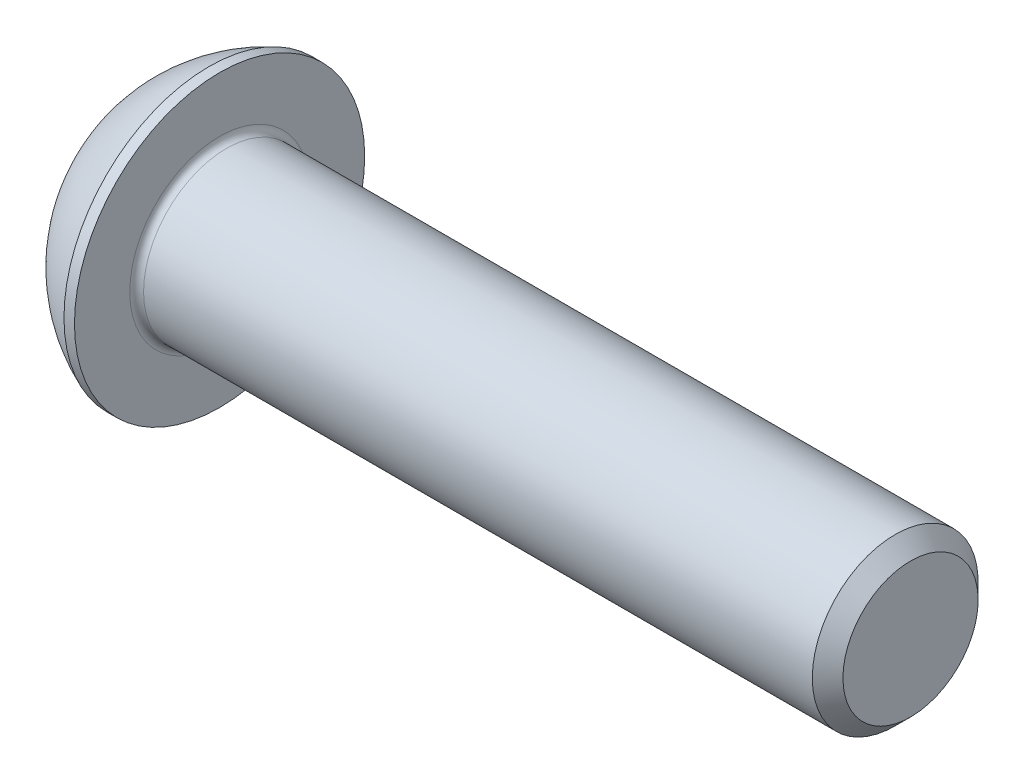
ISO-10303-21;
HEADER;
FILE_DESCRIPTION(('STEP AP214'),'2;1');
FILE_NAME('part.step','',(''),(''),'','','');
FILE_SCHEMA(('AUTOMOTIVE_DESIGN { 1 0 10303 214 1 1 1 1 }'));
ENDSEC;
DATA;
#1=APPLICATION_CONTEXT('core data for automotive mechanical design processes');
#2=APPLICATION_PROTOCOL_DEFINITION('international standard','automotive_design',2000,#1);
#3=PRODUCT_CONTEXT('',#1,'mechanical');
#4=PRODUCT('Part','Part','',(#3));
#5=PRODUCT_RELATED_PRODUCT_CATEGORY('part','',(#4));
#6=PRODUCT_DEFINITION_FORMATION('','',#4);
#7=PRODUCT_DEFINITION_CONTEXT('part definition',#1,'design');
#8=PRODUCT_DEFINITION('design','',#6,#7);
#9=PRODUCT_DEFINITION_SHAPE('','',#8);
#10=(LENGTH_UNIT() NAMED_UNIT(*) SI_UNIT(.MILLI.,.METRE.));
#11=(NAMED_UNIT(*) PLANE_ANGLE_UNIT() SI_UNIT($,.RADIAN.));
#12=(NAMED_UNIT(*) SI_UNIT($,.STERADIAN.) SOLID_ANGLE_UNIT());
#13=UNCERTAINTY_MEASURE_WITH_UNIT(LENGTH_MEASURE(1.E-05),#10,'distance_accuracy_value','');
#14=(GEOMETRIC_REPRESENTATION_CONTEXT(3) GLOBAL_UNCERTAINTY_ASSIGNED_CONTEXT((#13)) GLOBAL_UNIT_ASSIGNED_CONTEXT((#10,
#11,#12)) REPRESENTATION_CONTEXT('',''));
#15=CARTESIAN_POINT('',(0.,0.,0.));
#16=DIRECTION('',(0.,0.,1.));
#17=DIRECTION('',(1.,0.,0.));
#18=AXIS2_PLACEMENT_3D('',#15,#16,#17);
#19=CARTESIAN_POINT('',(0.,0.,0.));
#20=DIRECTION('',(-1.,0.,0.));
#21=DIRECTION('',(0.,0.,1.));
#22=AXIS2_PLACEMENT_3D('',#19,#20,#21);
#23=PLANE('',#22);
#24=CARTESIAN_POINT('',(0.,0.,0.));
#25=DIRECTION('',(-1.,0.,0.));
#26=DIRECTION('',(0.,0.,1.));
#27=AXIS2_PLACEMENT_3D('',#24,#25,#26);
#28=CIRCLE('',#27,2.625);
#29=CARTESIAN_POINT('',(0.,2.625,0.));
#30=VERTEX_POINT('',#29);
#31=EDGE_CURVE('E157',#30,#30,#28,.T.);
#32=ORIENTED_EDGE('',*,*,#31,.T.);
#33=EDGE_LOOP('',(#32));
#34=FACE_BOUND('',#33,.T.);
#35=DIRECTION('',(0.,-1.,0.));
#36=VECTOR('',#35,1.);
#37=CARTESIAN_POINT('',(0.,-1.15470053837925,2.));
#38=LINE('',#37,#36);
#39=CARTESIAN_POINT('',(0.,1.15470053837925,2.));
#40=VERTEX_POINT('',#39);
#41=CARTESIAN_POINT('',(0.,-1.15470053837925,2.));
#42=VERTEX_POINT('',#41);
#43=EDGE_CURVE('E47',#40,#42,#38,.T.);
#44=ORIENTED_EDGE('',*,*,#43,.T.);
#45=DIRECTION('',(0.,-0.5,-0.866025403784439));
#46=VECTOR('',#45,1.);
#47=CARTESIAN_POINT('',(0.,-2.3094010767585,0.));
#48=LINE('',#47,#46);
#49=CARTESIAN_POINT('',(0.,-2.3094010767585,0.));
#50=VERTEX_POINT('',#49);
#51=EDGE_CURVE('E250',#42,#50,#48,.T.);
#52=ORIENTED_EDGE('',*,*,#51,.T.);
#53=DIRECTION('',(0.,0.5,-0.866025403784439));
#54=VECTOR('',#53,1.);
#55=CARTESIAN_POINT('',(0.,-1.15470053837925,-2.));
#56=LINE('',#55,#54);
#57=CARTESIAN_POINT('',(0.,-1.15470053837925,-2.));
#58=VERTEX_POINT('',#57);
#59=EDGE_CURVE('E132',#50,#58,#56,.T.);
#60=ORIENTED_EDGE('',*,*,#59,.T.);
#61=DIRECTION('',(0.,1.,0.));
#62=VECTOR('',#61,1.);
#63=CARTESIAN_POINT('',(0.,1.15470053837925,-2.));
#64=LINE('',#63,#62);
#65=CARTESIAN_POINT('',(0.,1.15470053837925,-2.));
#66=VERTEX_POINT('',#65);
#67=EDGE_CURVE('E253',#58,#66,#64,.T.);
#68=ORIENTED_EDGE('',*,*,#67,.T.);
#69=DIRECTION('',(0.,0.5,0.866025403784438));
#70=VECTOR('',#69,1.);
#71=CARTESIAN_POINT('',(0.,2.3094010767585,0.));
#72=LINE('',#71,#70);
#73=CARTESIAN_POINT('',(0.,2.3094010767585,0.));
#74=VERTEX_POINT('',#73);
#75=EDGE_CURVE('E255',#66,#74,#72,.T.);
#76=ORIENTED_EDGE('',*,*,#75,.T.);
#77=DIRECTION('',(0.,-0.5,0.866025403784439));
#78=VECTOR('',#77,1.);
#79=CARTESIAN_POINT('',(0.,1.15470053837925,2.));
#80=LINE('',#79,#78);
#81=EDGE_CURVE('E257',#74,#40,#80,.T.);
#82=ORIENTED_EDGE('',*,*,#81,.T.);
#83=EDGE_LOOP('',(#44,#52,#60,#68,#76,#82));
#84=FACE_BOUND('',#83,.T.);
#85=ADVANCED_FACE('F32',(#34,#84),#23,.T.);
#86=CARTESIAN_POINT('',(4.99970462328767,0.,0.));
#87=DIRECTION('',(-1.,0.,0.));
#88=DIRECTION('',(0.,1.,0.));
#89=AXIS2_PLACEMENT_3D('',#86,#87,#88);
#90=SPHERICAL_SURFACE('',#89,5.64691697478581);
#91=CARTESIAN_POINT('',(2.92,0.,0.));
#92=DIRECTION('',(-1.,0.,0.));
#93=DIRECTION('',(0.,0.,1.));
#94=AXIS2_PLACEMENT_3D('',#91,#92,#93);
#95=CIRCLE('',#94,5.25);
#96=CARTESIAN_POINT('',(2.92,5.25,0.));
#97=VERTEX_POINT('',#96);
#98=EDGE_CURVE('E154',#97,#97,#95,.T.);
#99=CARTESIAN_POINT('',(2.92,5.25,0.));
#100=CARTESIAN_POINT('',(2.88116333139993,5.23461555496798,0.));
#101=CARTESIAN_POINT('',(2.84249743445724,5.21880002304115,0.));
#102=CARTESIAN_POINT('',(2.76552608609883,5.18631490596424,0.));
#103=CARTESIAN_POINT('',(2.72722063468312,5.16964532081416,0.));
#104=CARTESIAN_POINT('',(2.65098907959088,5.13546021785716,0.));
#105=CARTESIAN_POINT('',(2.61306297591435,5.11794470005024,0.));
#106=CARTESIAN_POINT('',(2.5376087841269,5.08207638165227,0.));
#107=CARTESIAN_POINT('',(2.50008069601598,5.06372358106122,0.));
#108=CARTESIAN_POINT('',(2.42544101991594,5.02618972911532,0.));
#109=CARTESIAN_POINT('',(2.38832943192683,5.00700867776048,0.));
#110=CARTESIAN_POINT('',(2.31454103209333,4.9678277722965,0.));
#111=CARTESIAN_POINT('',(2.27786422024896,4.94782791818736,0.));
#112=CARTESIAN_POINT('',(2.204963435524,4.90701925630078,0.));
#113=CARTESIAN_POINT('',(2.16873946264343,4.88621044852334,0.));
#114=CARTESIAN_POINT('',(2.09676219540545,4.84379412736126,0.));
#115=CARTESIAN_POINT('',(2.06100890104806,4.82218661397662,0.));
#116=CARTESIAN_POINT('',(1.9899905986814,4.77818352285276,0.));
#117=CARTESIAN_POINT('',(1.95472559067213,4.75578794511354,0.));
#118=CARTESIAN_POINT('',(1.88470122833741,4.7102197546814,0.));
#119=CARTESIAN_POINT('',(1.84994187401195,4.68704714198848,0.));
#120=CARTESIAN_POINT('',(1.78094593736053,4.63993629371345,0.));
#121=CARTESIAN_POINT('',(1.74670935503456,4.61599805813134,0.));
#122=CARTESIAN_POINT('',(1.67877582324134,4.56736775320002,0.));
#123=CARTESIAN_POINT('',(1.6450788737741,4.54267568385081,0.));
#124=CARTESIAN_POINT('',(1.57824120279908,4.4925498717552,0.));
#125=CARTESIAN_POINT('',(1.54510048129131,4.4671161290088,0.));
#126=CARTESIAN_POINT('',(1.4793915874043,4.4155194957489,0.));
#127=CARTESIAN_POINT('',(1.44682341502507,4.38935660523539,0.));
#128=CARTESIAN_POINT('',(1.3822756585948,4.33631456116252,0.));
#129=CARTESIAN_POINT('',(1.35029607454376,4.30943540760316,0.));
#130=CARTESIAN_POINT('',(1.28694124410103,4.2549740749057,0.));
#131=CARTESIAN_POINT('',(1.25556599770935,4.22739189576759,0.));
#132=CARTESIAN_POINT('',(1.19343529429185,4.17153809560631,0.));
#133=CARTESIAN_POINT('',(1.16267983726603,4.14326647458314,0.));
#134=CARTESIAN_POINT('',(1.10180385905236,4.0860477138823,0.));
#135=CARTESIAN_POINT('',(1.07168333786452,4.05710057420464,0.));
#136=CARTESIAN_POINT('',(1.01209206510522,3.99854503210539,0.));
#137=CARTESIAN_POINT('',(0.982621313533778,3.96893662968379,0.));
#138=CARTESIAN_POINT('',(0.924344093786625,3.90907314366641,0.));
#139=CARTESIAN_POINT('',(0.895537625610919,3.87881806007063,0.));
#140=CARTESIAN_POINT('',(0.838603159287822,3.8176761117527,0.));
#141=CARTESIAN_POINT('',(0.810475161140432,3.78678924703054,0.));
#142=CARTESIAN_POINT('',(0.754911487372877,3.72439894764781,0.));
#143=CARTESIAN_POINT('',(0.727475811752714,3.69289551298725,0.));
#144=CARTESIAN_POINT('',(0.673310294583732,3.62928758856413,0.));
#145=CARTESIAN_POINT('',(0.646580453034914,3.59718309880159,0.));
#146=CARTESIAN_POINT('',(0.593839767940169,3.53238887502059,0.));
#147=CARTESIAN_POINT('',(0.567828924394242,3.49969914100215,0.));
#148=CARTESIAN_POINT('',(0.516539045154726,3.43375052777114,0.));
#149=CARTESIAN_POINT('',(0.491260009461135,3.40049164855857,0.));
#150=CARTESIAN_POINT('',(0.441446195334814,3.33342112431611,0.));
#151=CARTESIAN_POINT('',(0.416911416902083,3.29960947928621,0.));
#152=CARTESIAN_POINT('',(0.368598200321404,3.23145007493057,0.));
#153=CARTESIAN_POINT('',(0.344819762173456,3.19710231560483,0.));
#154=CARTESIAN_POINT('',(0.298030936151543,3.12788759851044,0.));
#155=CARTESIAN_POINT('',(0.275020548277578,3.09302064074179,0.));
#156=CARTESIAN_POINT('',(0.229779156601617,3.02278469716988,0.));
#157=CARTESIAN_POINT('',(0.207548152799621,2.98741571136661,0.));
#158=CARTESIAN_POINT('',(0.163876471550351,2.91619313362712,0.));
#159=CARTESIAN_POINT('',(0.142435794103077,2.8803395416909,0.));
#160=CARTESIAN_POINT('',(0.100355347300805,2.80816539636944,0.));
#161=CARTESIAN_POINT('',(0.0797155779458076,2.7718448429842,0.));
#162=CARTESIAN_POINT('',(0.0392470276158927,2.69875470867178,0.));
#163=CARTESIAN_POINT('',(0.0194182466409756,2.66198512774461,0.));
#164=CARTESIAN_POINT('',(0.,2.625,0.));
#165=B_SPLINE_CURVE_WITH_KNOTS('',3,(#99,#100,#101,#102,#103,#104,#105,#106,#107,#108,#109,#110,
#111,#112,#113,#114,#115,#116,#117,#118,#119,#120,#121,#122,#123,#124,#125,#126,#127,#128,#129,
#130,#131,#132,#133,#134,#135,#136,#137,#138,#139,#140,#141,#142,#143,#144,#145,#146,#147,#148,
#149,#150,#151,#152,#153,#154,#155,#156,#157,#158,#159,#160,#161,#162,#163,#164),.UNSPECIFIED.,
.F.,.F.,(4,2,2,2,2,2,2,2,2,2,2,2,2,2,2,2,2,2,2,2,2,2,2,2,2,2,2,2,2,2,2,2,4),(0.,
0.12531586463099,0.25063172926198,0.37594759389297,0.50126345852396,0.626579323154949,
0.75189518778594,0.87721105241693,1.00252691704792,1.12784278167891,1.2531586463099,
1.37847451094089,1.50379037557188,1.62910624020287,1.75442210483386,1.87973796946485,
2.00505383409584,2.13036969872683,2.25568556335782,2.38100142798881,2.5063172926198,
2.63163315725079,2.75694902188178,2.88226488651277,3.00758075114376,3.13289661577475,
3.25821248040574,3.38352834503673,3.50884420966772,3.63416007429871,3.7594759389297,
3.88479180356069,4.01010766819168),.UNSPECIFIED.);
#166=EDGE_CURVE('BSEAM178',#97,#30,#165,.T.);
#167=ORIENTED_EDGE('',*,*,#98,.T.);
#168=ORIENTED_EDGE('',*,*,#31,.F.);
#169=ORIENTED_EDGE('',*,*,#166,.T.);
#170=ORIENTED_EDGE('',*,*,#166,.F.);
#171=EDGE_LOOP('',(#167,#169,#168,#170));
#172=FACE_BOUND('',#171,.T.);
#173=ADVANCED_FACE('F178',(#172),#90,.T.);
#174=CARTESIAN_POINT('',(0.,0.,0.));
#175=DIRECTION('',(-1.,0.,0.));
#176=DIRECTION('',(0.,0.,1.));
#177=AXIS2_PLACEMENT_3D('',#174,#175,#176);
#178=CYLINDRICAL_SURFACE('',#177,5.25);
#179=ORIENTED_EDGE('',*,*,#98,.F.);
#180=EDGE_LOOP('',(#179));
#181=FACE_BOUND('',#180,.T.);
#182=CARTESIAN_POINT('',(3.3,0.,0.));
#183=DIRECTION('',(-1.,0.,0.));
#184=DIRECTION('',(0.,0.,1.));
#185=AXIS2_PLACEMENT_3D('',#182,#183,#184);
#186=CIRCLE('',#185,5.25);
#187=CARTESIAN_POINT('',(3.3,0.,5.25));
#188=VERTEX_POINT('',#187);
#189=EDGE_CURVE('E151',#188,#188,#186,.T.);
#190=ORIENTED_EDGE('',*,*,#189,.T.);
#191=EDGE_LOOP('',(#190));
#192=FACE_BOUND('',#191,.T.);
#193=ADVANCED_FACE('F183',(#181,#192),#178,.T.);
#194=CARTESIAN_POINT('',(3.3,3.,0.));
#195=DIRECTION('',(-1.,0.,0.));
#196=DIRECTION('',(0.,0.,1.));
#197=AXIS2_PLACEMENT_3D('',#194,#195,#196);
#198=PLANE('',#197);
#199=CARTESIAN_POINT('',(3.3,0.,0.));
#200=DIRECTION('',(-1.,0.,0.));
#201=DIRECTION('',(0.,0.,1.));
#202=AXIS2_PLACEMENT_3D('',#199,#200,#201);
#203=CIRCLE('',#202,3.25);
#204=CARTESIAN_POINT('',(3.3,0.,3.25));
#205=VERTEX_POINT('',#204);
#206=EDGE_CURVE('E40',#205,#205,#203,.T.);
#207=ORIENTED_EDGE('',*,*,#206,.T.);
#208=EDGE_LOOP('',(#207));
#209=FACE_BOUND('',#208,.T.);
#210=ORIENTED_EDGE('',*,*,#189,.F.);
#211=EDGE_LOOP('',(#210));
#212=FACE_BOUND('',#211,.T.);
#213=ADVANCED_FACE('F162',(#209,#212),#198,.F.);
#214=CARTESIAN_POINT('',(0.,0.,0.));
#215=DIRECTION('',(-1.,0.,0.));
#216=DIRECTION('',(0.,0.,1.));
#217=AXIS2_PLACEMENT_3D('',#214,#215,#216);
#218=CYLINDRICAL_SURFACE('',#217,3.);
#219=CARTESIAN_POINT('',(3.55,0.,0.));
#220=DIRECTION('',(-1.,0.,0.));
#221=DIRECTION('',(0.,0.,1.));
#222=AXIS2_PLACEMENT_3D('',#219,#220,#221);
#223=CIRCLE('',#222,3.);
#224=CARTESIAN_POINT('',(3.55,0.,3.));
#225=VERTEX_POINT('',#224);
#226=EDGE_CURVE('E11',#225,#225,#223,.F.);
#227=ORIENTED_EDGE('',*,*,#226,.T.);
#228=EDGE_LOOP('',(#227));
#229=FACE_BOUND('',#228,.T.);
#230=CARTESIAN_POINT('',(27.7455,0.,0.));
#231=DIRECTION('',(-1.,0.,0.));
#232=DIRECTION('',(0.,0.,1.));
#233=AXIS2_PLACEMENT_3D('',#230,#231,#232);
#234=CIRCLE('',#233,3.);
#235=CARTESIAN_POINT('',(27.7455,0.,3.));
#236=VERTEX_POINT('',#235);
#237=EDGE_CURVE('E148',#236,#236,#234,.T.);
#238=ORIENTED_EDGE('',*,*,#237,.T.);
#239=EDGE_LOOP('',(#238));
#240=FACE_BOUND('',#239,.T.);
#241=ADVANCED_FACE('F192',(#229,#240),#218,.T.);
#242=CARTESIAN_POINT('',(28.3,0.,0.));
#243=DIRECTION('',(-1.,0.,0.));
#244=DIRECTION('',(0.,0.,1.));
#245=AXIS2_PLACEMENT_3D('',#242,#243,#244);
#246=CONICAL_SURFACE('',#245,2.4455,0.785398163397442);
#247=ORIENTED_EDGE('',*,*,#237,.F.);
#248=EDGE_LOOP('',(#247));
#249=FACE_BOUND('',#248,.T.);
#250=CARTESIAN_POINT('',(28.3,0.,0.));
#251=DIRECTION('',(-1.,0.,0.));
#252=DIRECTION('',(0.,0.,1.));
#253=AXIS2_PLACEMENT_3D('',#250,#251,#252);
#254=CIRCLE('',#253,2.4455);
#255=CARTESIAN_POINT('',(28.3,0.,2.4455));
#256=VERTEX_POINT('',#255);
#257=EDGE_CURVE('E144',#256,#256,#254,.T.);
#258=ORIENTED_EDGE('',*,*,#257,.T.);
#259=EDGE_LOOP('',(#258));
#260=FACE_BOUND('',#259,.T.);
#261=ADVANCED_FACE('F173',(#249,#260),#246,.T.);
#262=CARTESIAN_POINT('',(28.3,0.,0.));
#263=DIRECTION('',(-1.,0.,0.));
#264=DIRECTION('',(0.,0.,1.));
#265=AXIS2_PLACEMENT_3D('',#262,#263,#264);
#266=PLANE('',#265);
#267=ORIENTED_EDGE('',*,*,#257,.F.);
#268=EDGE_LOOP('',(#267));
#269=FACE_BOUND('',#268,.T.);
#270=ADVANCED_FACE('F166',(#269),#266,.F.);
#271=CARTESIAN_POINT('',(3.55,0.,0.));
#272=DIRECTION('',(-1.,0.,0.));
#273=DIRECTION('',(0.,0.,1.));
#274=AXIS2_PLACEMENT_3D('',#271,#272,#273);
#275=TOROIDAL_SURFACE('',#274,3.25,0.25);
#276=ORIENTED_EDGE('',*,*,#226,.F.);
#277=EDGE_LOOP('',(#276));
#278=FACE_BOUND('',#277,.T.);
#279=ORIENTED_EDGE('',*,*,#206,.F.);
#280=EDGE_LOOP('',(#279));
#281=FACE_BOUND('',#280,.T.);
#282=ADVANCED_FACE('F34',(#278,#281),#275,.F.);
#283=CARTESIAN_POINT('',(2.08,-2.3094010767585,0.));
#284=DIRECTION('',(0.,0.866025403784439,-0.5));
#285=DIRECTION('',(0.,0.5,0.866025403784439));
#286=AXIS2_PLACEMENT_3D('',#283,#284,#285);
#287=PLANE('',#286);
#288=DIRECTION('',(0.,-0.5,-0.866025403784439));
#289=VECTOR('',#288,1.);
#290=CARTESIAN_POINT('',(2.08,-2.3094010767585,0.));
#291=LINE('',#290,#289);
#292=CARTESIAN_POINT('',(2.08,-1.15470053837925,2.));
#293=VERTEX_POINT('',#292);
#294=CARTESIAN_POINT('',(2.08,-1.73205080756888,1.));
#295=VERTEX_POINT('',#294);
#296=EDGE_CURVE('E115',#293,#295,#291,.T.);
#297=ORIENTED_EDGE('',*,*,#296,.T.);
#298=CARTESIAN_POINT('',(2.08,-2.3094010767585,0.));
#299=VERTEX_POINT('',#298);
#300=EDGE_CURVE('E108',#295,#299,#291,.T.);
#301=ORIENTED_EDGE('',*,*,#300,.T.);
#302=DIRECTION('',(-1.,0.,0.));
#303=VECTOR('',#302,1.);
#304=CARTESIAN_POINT('',(2.08,-2.3094010767585,0.));
#305=LINE('',#304,#303);
#306=EDGE_CURVE('E112',#299,#50,#305,.T.);
#307=ORIENTED_EDGE('',*,*,#306,.T.);
#308=ORIENTED_EDGE('',*,*,#51,.F.);
#309=DIRECTION('',(-1.,0.,0.));
#310=VECTOR('',#309,1.);
#311=CARTESIAN_POINT('',(2.08,-1.15470053837925,2.));
#312=LINE('',#311,#310);
#313=EDGE_CURVE('E240',#293,#42,#312,.T.);
#314=ORIENTED_EDGE('',*,*,#313,.F.);
#315=EDGE_LOOP('',(#297,#301,#307,#308,#314));
#316=FACE_BOUND('',#315,.T.);
#317=ADVANCED_FACE('F110',(#316),#287,.T.);
#318=CARTESIAN_POINT('',(2.08,-1.15470053837925,-2.));
#319=DIRECTION('',(0.,0.866025403784439,0.5));
#320=DIRECTION('',(0.,-0.5,0.866025403784439));
#321=AXIS2_PLACEMENT_3D('',#318,#319,#320);
#322=PLANE('',#321);
#323=DIRECTION('',(0.,0.5,-0.866025403784439));
#324=VECTOR('',#323,1.);
#325=CARTESIAN_POINT('',(2.08,-1.15470053837925,-2.));
#326=LINE('',#325,#324);
#327=CARTESIAN_POINT('',(2.08,-1.73205080756888,-1.));
#328=VERTEX_POINT('',#327);
#329=EDGE_CURVE('E120',#299,#328,#326,.T.);
#330=ORIENTED_EDGE('',*,*,#329,.T.);
#331=CARTESIAN_POINT('',(2.08,-1.15470053837925,-2.));
#332=VERTEX_POINT('',#331);
#333=EDGE_CURVE('E127',#328,#332,#326,.T.);
#334=ORIENTED_EDGE('',*,*,#333,.T.);
#335=DIRECTION('',(-1.,0.,0.));
#336=VECTOR('',#335,1.);
#337=CARTESIAN_POINT('',(2.08,-1.15470053837925,-2.));
#338=LINE('',#337,#336);
#339=EDGE_CURVE('E134',#332,#58,#338,.T.);
#340=ORIENTED_EDGE('',*,*,#339,.T.);
#341=ORIENTED_EDGE('',*,*,#59,.F.);
#342=ORIENTED_EDGE('',*,*,#306,.F.);
#343=EDGE_LOOP('',(#330,#334,#340,#341,#342));
#344=FACE_BOUND('',#343,.T.);
#345=ADVANCED_FACE('F130',(#344),#322,.T.);
#346=CARTESIAN_POINT('',(2.08,1.15470053837925,-2.));
#347=DIRECTION('',(0.,0.,1.));
#348=DIRECTION('',(1.,0.,0.));
#349=AXIS2_PLACEMENT_3D('',#346,#347,#348);
#350=PLANE('',#349);
#351=DIRECTION('',(0.,1.,0.));
#352=VECTOR('',#351,1.);
#353=CARTESIAN_POINT('',(2.08,1.15470053837925,-2.));
#354=LINE('',#353,#352);
#355=CARTESIAN_POINT('',(2.08,0.,-2.));
#356=VERTEX_POINT('',#355);
#357=EDGE_CURVE('E276',#332,#356,#354,.T.);
#358=ORIENTED_EDGE('',*,*,#357,.T.);
#359=CARTESIAN_POINT('',(2.08,1.15470053837925,-2.));
#360=VERTEX_POINT('',#359);
#361=EDGE_CURVE('E126',#356,#360,#354,.T.);
#362=ORIENTED_EDGE('',*,*,#361,.T.);
#363=DIRECTION('',(-1.,0.,0.));
#364=VECTOR('',#363,1.);
#365=CARTESIAN_POINT('',(2.08,1.15470053837925,-2.));
#366=LINE('',#365,#364);
#367=EDGE_CURVE('E139',#360,#66,#366,.T.);
#368=ORIENTED_EDGE('',*,*,#367,.T.);
#369=ORIENTED_EDGE('',*,*,#67,.F.);
#370=ORIENTED_EDGE('',*,*,#339,.F.);
#371=EDGE_LOOP('',(#358,#362,#368,#369,#370));
#372=FACE_BOUND('',#371,.T.);
#373=ADVANCED_FACE('F206',(#372),#350,.T.);
#374=CARTESIAN_POINT('',(2.08,2.3094010767585,0.));
#375=DIRECTION('',(0.,-0.866025403784438,0.5));
#376=DIRECTION('',(0.,-0.5,-0.866025403784439));
#377=AXIS2_PLACEMENT_3D('',#374,#375,#376);
#378=PLANE('',#377);
#379=DIRECTION('',(0.,0.5,0.866025403784438));
#380=VECTOR('',#379,1.);
#381=CARTESIAN_POINT('',(2.08,2.3094010767585,0.));
#382=LINE('',#381,#380);
#383=CARTESIAN_POINT('',(2.08,1.73205080756888,-1.));
#384=VERTEX_POINT('',#383);
#385=EDGE_CURVE('E282',#360,#384,#382,.T.);
#386=ORIENTED_EDGE('',*,*,#385,.T.);
#387=CARTESIAN_POINT('',(2.08,2.3094010767585,0.));
#388=VERTEX_POINT('',#387);
#389=EDGE_CURVE('E280',#384,#388,#382,.T.);
#390=ORIENTED_EDGE('',*,*,#389,.T.);
#391=DIRECTION('',(-1.,0.,0.));
#392=VECTOR('',#391,1.);
#393=CARTESIAN_POINT('',(2.08,2.3094010767585,0.));
#394=LINE('',#393,#392);
#395=EDGE_CURVE('E262',#388,#74,#394,.T.);
#396=ORIENTED_EDGE('',*,*,#395,.T.);
#397=ORIENTED_EDGE('',*,*,#75,.F.);
#398=ORIENTED_EDGE('',*,*,#367,.F.);
#399=EDGE_LOOP('',(#386,#390,#396,#397,#398));
#400=FACE_BOUND('',#399,.T.);
#401=ADVANCED_FACE('F209',(#400),#378,.T.);
#402=CARTESIAN_POINT('',(2.08,1.15470053837925,2.));
#403=DIRECTION('',(0.,-0.866025403784439,-0.5));
#404=DIRECTION('',(0.,0.5,-0.866025403784439));
#405=AXIS2_PLACEMENT_3D('',#402,#403,#404);
#406=PLANE('',#405);
#407=DIRECTION('',(0.,-0.5,0.866025403784439));
#408=VECTOR('',#407,1.);
#409=CARTESIAN_POINT('',(2.08,1.15470053837925,2.));
#410=LINE('',#409,#408);
#411=CARTESIAN_POINT('',(2.08,1.73205080756888,1.));
#412=VERTEX_POINT('',#411);
#413=EDGE_CURVE('E246',#388,#412,#410,.T.);
#414=ORIENTED_EDGE('',*,*,#413,.T.);
#415=CARTESIAN_POINT('',(2.08,1.15470053837925,2.));
#416=VERTEX_POINT('',#415);
#417=EDGE_CURVE('E238',#412,#416,#410,.T.);
#418=ORIENTED_EDGE('',*,*,#417,.T.);
#419=DIRECTION('',(-1.,0.,0.));
#420=VECTOR('',#419,1.);
#421=CARTESIAN_POINT('',(2.08,1.15470053837925,2.));
#422=LINE('',#421,#420);
#423=EDGE_CURVE('E244',#416,#40,#422,.T.);
#424=ORIENTED_EDGE('',*,*,#423,.T.);
#425=ORIENTED_EDGE('',*,*,#81,.F.);
#426=ORIENTED_EDGE('',*,*,#395,.F.);
#427=EDGE_LOOP('',(#414,#418,#424,#425,#426));
#428=FACE_BOUND('',#427,.T.);
#429=ADVANCED_FACE('F213',(#428),#406,.T.);
#430=CARTESIAN_POINT('',(2.08,-1.15470053837925,2.));
#431=DIRECTION('',(0.,0.,-1.));
#432=DIRECTION('',(0.,1.,0.));
#433=AXIS2_PLACEMENT_3D('',#430,#431,#432);
#434=PLANE('',#433);
#435=DIRECTION('',(0.,-1.,0.));
#436=VECTOR('',#435,1.);
#437=CARTESIAN_POINT('',(2.08,-1.15470053837925,2.));
#438=LINE('',#437,#436);
#439=CARTESIAN_POINT('',(2.08,0.,2.));
#440=VERTEX_POINT('',#439);
#441=EDGE_CURVE('E55',#416,#440,#438,.T.);
#442=ORIENTED_EDGE('',*,*,#441,.T.);
#443=EDGE_CURVE('E241',#440,#293,#438,.T.);
#444=ORIENTED_EDGE('',*,*,#443,.T.);
#445=ORIENTED_EDGE('',*,*,#313,.T.);
#446=ORIENTED_EDGE('',*,*,#43,.F.);
#447=ORIENTED_EDGE('',*,*,#423,.F.);
#448=EDGE_LOOP('',(#442,#444,#445,#446,#447));
#449=FACE_BOUND('',#448,.T.);
#450=ADVANCED_FACE('F217',(#449),#434,.T.);
#451=CARTESIAN_POINT('',(2.08,0.,4.));
#452=DIRECTION('',(-1.,0.,0.));
#453=DIRECTION('',(0.,0.,1.));
#454=AXIS2_PLACEMENT_3D('',#451,#452,#453);
#455=PLANE('',#454);
#456=ORIENTED_EDGE('',*,*,#441,.F.);
#457=ORIENTED_EDGE('',*,*,#417,.F.);
#458=CARTESIAN_POINT('',(2.08,0.,0.));
#459=DIRECTION('',(-1.,0.,0.));
#460=DIRECTION('',(0.,0.,1.));
#461=AXIS2_PLACEMENT_3D('',#458,#459,#460);
#462=CIRCLE('',#461,2.);
#463=EDGE_CURVE('E138',#440,#412,#462,.T.);
#464=ORIENTED_EDGE('',*,*,#463,.F.);
#465=EDGE_LOOP('',(#456,#457,#464));
#466=FACE_BOUND('',#465,.T.);
#467=ADVANCED_FACE('F221',(#466),#455,.T.);
#468=ORIENTED_EDGE('',*,*,#413,.F.);
#469=ORIENTED_EDGE('',*,*,#389,.F.);
#470=EDGE_CURVE('E145',#412,#384,#462,.T.);
#471=ORIENTED_EDGE('',*,*,#470,.F.);
#472=EDGE_LOOP('',(#468,#469,#471));
#473=FACE_BOUND('',#472,.T.);
#474=ADVANCED_FACE('F229',(#473),#455,.T.);
#475=ORIENTED_EDGE('',*,*,#385,.F.);
#476=ORIENTED_EDGE('',*,*,#361,.F.);
#477=EDGE_CURVE('E287',#384,#356,#462,.T.);
#478=ORIENTED_EDGE('',*,*,#477,.F.);
#479=EDGE_LOOP('',(#475,#476,#478));
#480=FACE_BOUND('',#479,.T.);
#481=ADVANCED_FACE('F234',(#480),#455,.T.);
#482=ORIENTED_EDGE('',*,*,#357,.F.);
#483=ORIENTED_EDGE('',*,*,#333,.F.);
#484=EDGE_CURVE('E279',#356,#328,#462,.T.);
#485=ORIENTED_EDGE('',*,*,#484,.F.);
#486=EDGE_LOOP('',(#482,#483,#485));
#487=FACE_BOUND('',#486,.T.);
#488=ADVANCED_FACE('F227',(#487),#455,.T.);
#489=ORIENTED_EDGE('',*,*,#329,.F.);
#490=ORIENTED_EDGE('',*,*,#300,.F.);
#491=EDGE_CURVE('E122',#328,#295,#462,.T.);
#492=ORIENTED_EDGE('',*,*,#491,.F.);
#493=EDGE_LOOP('',(#489,#490,#492));
#494=FACE_BOUND('',#493,.T.);
#495=ADVANCED_FACE('F121',(#494),#455,.T.);
#496=ORIENTED_EDGE('',*,*,#296,.F.);
#497=ORIENTED_EDGE('',*,*,#443,.F.);
#498=EDGE_CURVE('E133',#295,#440,#462,.T.);
#499=ORIENTED_EDGE('',*,*,#498,.F.);
#500=EDGE_LOOP('',(#496,#497,#499));
#501=FACE_BOUND('',#500,.T.);
#502=ADVANCED_FACE('F201',(#501),#455,.T.);
#503=CARTESIAN_POINT('',(3.23470053837926,0.,0.));
#504=DIRECTION('',(-1.,0.,0.));
#505=DIRECTION('',(0.,0.,1.));
#506=AXIS2_PLACEMENT_3D('',#503,#504,#505);
#507=CONICAL_SURFACE('',#506,0.,1.04719755119659);
#508=ORIENTED_EDGE('',*,*,#463,.T.);
#509=ORIENTED_EDGE('',*,*,#470,.T.);
#510=ORIENTED_EDGE('',*,*,#477,.T.);
#511=ORIENTED_EDGE('',*,*,#484,.T.);
#512=ORIENTED_EDGE('',*,*,#491,.T.);
#513=ORIENTED_EDGE('',*,*,#498,.T.);
#514=EDGE_LOOP('',(#508,#509,#510,#511,#512,#513));
#515=FACE_BOUND('',#514,.T.);
#516=CARTESIAN_POINT('',(3.23470053837926,0.,0.));
#517=VERTEX_POINT('',#516);
#518=VERTEX_LOOP('',#517);
#519=FACE_BOUND('',#518,.T.);
#520=ADVANCED_FACE('F199',(#515,#519),#507,.F.);
#521=CLOSED_SHELL('',(#85,#173,#193,#213,#241,#261,#270,#282,#317,#345,#373,#401,#429,#450,#467,
#474,#481,#488,#495,#502,#520));
#522=MANIFOLD_SOLID_BREP('B2',#521);
#523=ADVANCED_BREP_SHAPE_REPRESENTATION('',(#18,#522),#14);
#524=SHAPE_DEFINITION_REPRESENTATION(#9,#523);
ENDSEC;
END-ISO-10303-21;
